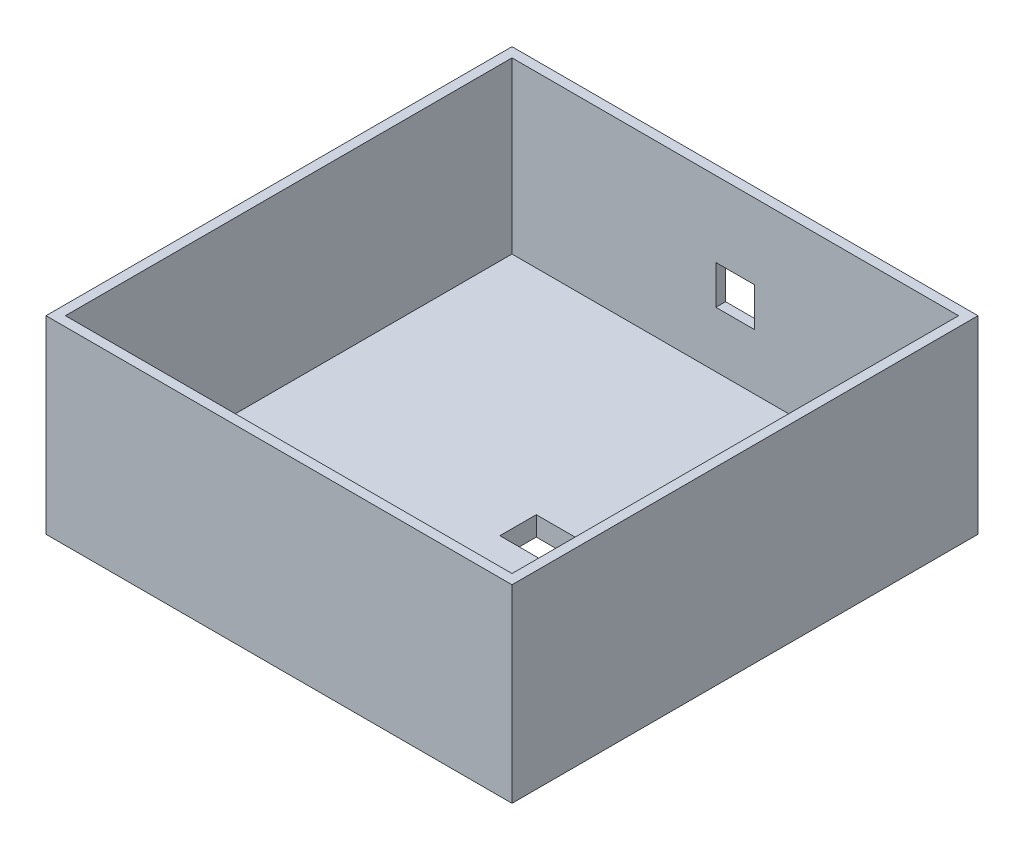
ISO-10303-21;
HEADER;
FILE_DESCRIPTION(('STEP AP214'),'2;1');
FILE_NAME('part.step','',(''),(''),'','','');
FILE_SCHEMA(('AUTOMOTIVE_DESIGN { 1 0 10303 214 1 1 1 1 }'));
ENDSEC;
DATA;
#1=APPLICATION_CONTEXT('core data for automotive mechanical design processes');
#2=APPLICATION_PROTOCOL_DEFINITION('international standard','automotive_design',2000,#1);
#3=PRODUCT_CONTEXT('',#1,'mechanical');
#4=PRODUCT('Part','Part','',(#3));
#5=PRODUCT_RELATED_PRODUCT_CATEGORY('part','',(#4));
#6=PRODUCT_DEFINITION_FORMATION('','',#4);
#7=PRODUCT_DEFINITION_CONTEXT('part definition',#1,'design');
#8=PRODUCT_DEFINITION('design','',#6,#7);
#9=PRODUCT_DEFINITION_SHAPE('','',#8);
#10=(LENGTH_UNIT() NAMED_UNIT(*) SI_UNIT(.MILLI.,.METRE.));
#11=(NAMED_UNIT(*) PLANE_ANGLE_UNIT() SI_UNIT($,.RADIAN.));
#12=(NAMED_UNIT(*) SI_UNIT($,.STERADIAN.) SOLID_ANGLE_UNIT());
#13=UNCERTAINTY_MEASURE_WITH_UNIT(LENGTH_MEASURE(1.E-05),#10,'distance_accuracy_value','');
#14=(GEOMETRIC_REPRESENTATION_CONTEXT(3) GLOBAL_UNCERTAINTY_ASSIGNED_CONTEXT((#13)) GLOBAL_UNIT_ASSIGNED_CONTEXT((#10,
#11,#12)) REPRESENTATION_CONTEXT('',''));
#15=CARTESIAN_POINT('',(0.,0.,0.));
#16=DIRECTION('',(0.,0.,1.));
#17=DIRECTION('',(1.,0.,0.));
#18=AXIS2_PLACEMENT_3D('',#15,#16,#17);
#19=CARTESIAN_POINT('',(0.,0.,0.));
#20=DIRECTION('',(0.,-1.,0.));
#21=DIRECTION('',(0.,0.,-1.));
#22=AXIS2_PLACEMENT_3D('',#19,#20,#21);
#23=PLANE('',#22);
#24=DIRECTION('',(0.,0.,-1.));
#25=VECTOR('',#24,1.);
#26=CARTESIAN_POINT('',(12.2500000000001,0.,-2.00000000000001));
#27=LINE('',#26,#25);
#28=CARTESIAN_POINT('',(12.2500000000001,0.,5.49999999999999));
#29=VERTEX_POINT('',#28);
#30=CARTESIAN_POINT('',(12.2500000000001,0.,-2.00000000000001));
#31=VERTEX_POINT('',#30);
#32=EDGE_CURVE('E244',#29,#31,#27,.T.);
#33=ORIENTED_EDGE('',*,*,#32,.T.);
#34=DIRECTION('',(-1.,0.,0.));
#35=VECTOR('',#34,1.);
#36=CARTESIAN_POINT('',(12.2500000000001,0.,-2.00000000000001));
#37=LINE('',#36,#35);
#38=CARTESIAN_POINT('',(3.00000000000012,0.,-2.00000000000001));
#39=VERTEX_POINT('',#38);
#40=EDGE_CURVE('E281',#31,#39,#37,.T.);
#41=ORIENTED_EDGE('',*,*,#40,.T.);
#42=DIRECTION('',(0.,0.,1.));
#43=VECTOR('',#42,1.);
#44=CARTESIAN_POINT('',(3.00000000000012,0.,-2.00000000000001));
#45=LINE('',#44,#43);
#46=CARTESIAN_POINT('',(3.00000000000012,0.,5.49999999999999));
#47=VERTEX_POINT('',#46);
#48=EDGE_CURVE('E278',#39,#47,#45,.T.);
#49=ORIENTED_EDGE('',*,*,#48,.T.);
#50=DIRECTION('',(1.,0.,0.));
#51=VECTOR('',#50,1.);
#52=CARTESIAN_POINT('',(12.2500000000001,0.,5.49999999999999));
#53=LINE('',#52,#51);
#54=EDGE_CURVE('E267',#47,#29,#53,.T.);
#55=ORIENTED_EDGE('',*,*,#54,.T.);
#56=EDGE_LOOP('',(#33,#41,#49,#55));
#57=FACE_BOUND('',#56,.T.);
#58=DIRECTION('',(0.,0.,1.));
#59=VECTOR('',#58,1.);
#60=CARTESIAN_POINT('',(-4.24999999999988,0.,19.5));
#61=LINE('',#60,#59);
#62=CARTESIAN_POINT('',(-4.24999999999988,0.,12.));
#63=VERTEX_POINT('',#62);
#64=CARTESIAN_POINT('',(-4.24999999999988,0.,19.5));
#65=VERTEX_POINT('',#64);
#66=EDGE_CURVE('E240',#63,#65,#61,.T.);
#67=ORIENTED_EDGE('',*,*,#66,.T.);
#68=DIRECTION('',(1.,0.,0.));
#69=VECTOR('',#68,1.);
#70=CARTESIAN_POINT('',(-4.24999999999988,0.,19.5));
#71=LINE('',#70,#69);
#72=CARTESIAN_POINT('',(5.00000000000012,0.,19.5));
#73=VERTEX_POINT('',#72);
#74=EDGE_CURVE('E243',#65,#73,#71,.T.);
#75=ORIENTED_EDGE('',*,*,#74,.T.);
#76=DIRECTION('',(0.,0.,-1.));
#77=VECTOR('',#76,1.);
#78=CARTESIAN_POINT('',(5.00000000000012,0.,19.5));
#79=LINE('',#78,#77);
#80=CARTESIAN_POINT('',(5.00000000000012,0.,12.));
#81=VERTEX_POINT('',#80);
#82=EDGE_CURVE('E247',#73,#81,#79,.T.);
#83=ORIENTED_EDGE('',*,*,#82,.T.);
#84=DIRECTION('',(-1.,0.,0.));
#85=VECTOR('',#84,1.);
#86=CARTESIAN_POINT('',(-4.24999999999988,0.,12.));
#87=LINE('',#86,#85);
#88=EDGE_CURVE('E250',#81,#63,#87,.T.);
#89=ORIENTED_EDGE('',*,*,#88,.T.);
#90=EDGE_LOOP('',(#67,#75,#83,#89));
#91=FACE_BOUND('',#90,.T.);
#92=DIRECTION('',(1.,0.,0.));
#93=VECTOR('',#92,1.);
#94=CARTESIAN_POINT('',(-48.,0.,48.));
#95=LINE('',#94,#93);
#96=CARTESIAN_POINT('',(-48.,0.,48.));
#97=VERTEX_POINT('',#96);
#98=CARTESIAN_POINT('',(48.,0.,48.));
#99=VERTEX_POINT('',#98);
#100=EDGE_CURVE('E212',#97,#99,#95,.T.);
#101=ORIENTED_EDGE('',*,*,#100,.F.);
#102=DIRECTION('',(0.,0.,1.));
#103=VECTOR('',#102,1.);
#104=CARTESIAN_POINT('',(-48.,0.,-48.));
#105=LINE('',#104,#103);
#106=CARTESIAN_POINT('',(-48.,0.,-48.));
#107=VERTEX_POINT('',#106);
#108=EDGE_CURVE('E54',#107,#97,#105,.T.);
#109=ORIENTED_EDGE('',*,*,#108,.F.);
#110=DIRECTION('',(-1.,0.,0.));
#111=VECTOR('',#110,1.);
#112=CARTESIAN_POINT('',(-48.,0.,-48.));
#113=LINE('',#112,#111);
#114=CARTESIAN_POINT('',(48.,0.,-48.));
#115=VERTEX_POINT('',#114);
#116=EDGE_CURVE('E219',#115,#107,#113,.T.);
#117=ORIENTED_EDGE('',*,*,#116,.F.);
#118=DIRECTION('',(0.,0.,-1.));
#119=VECTOR('',#118,1.);
#120=CARTESIAN_POINT('',(48.,0.,-48.));
#121=LINE('',#120,#119);
#122=EDGE_CURVE('E216',#99,#115,#121,.T.);
#123=ORIENTED_EDGE('',*,*,#122,.F.);
#124=EDGE_LOOP('',(#101,#109,#117,#123));
#125=FACE_BOUND('',#124,.T.);
#126=ADVANCED_FACE('F40',(#57,#91,#125),#23,.T.);
#127=CARTESIAN_POINT('',(0.,39.,0.));
#128=DIRECTION('',(0.,1.,0.));
#129=DIRECTION('',(0.,0.,1.));
#130=AXIS2_PLACEMENT_3D('',#127,#128,#129);
#131=PLANE('',#130);
#132=DIRECTION('',(0.,0.,1.));
#133=VECTOR('',#132,1.);
#134=CARTESIAN_POINT('',(-46.,39.,-46.));
#135=LINE('',#134,#133);
#136=CARTESIAN_POINT('',(-46.,39.,-46.));
#137=VERTEX_POINT('',#136);
#138=CARTESIAN_POINT('',(-46.,39.,46.));
#139=VERTEX_POINT('',#138);
#140=EDGE_CURVE('E313',#137,#139,#135,.T.);
#141=ORIENTED_EDGE('',*,*,#140,.F.);
#142=DIRECTION('',(-1.,0.,0.));
#143=VECTOR('',#142,1.);
#144=CARTESIAN_POINT('',(46.,39.,-46.));
#145=LINE('',#144,#143);
#146=CARTESIAN_POINT('',(46.,39.,-46.));
#147=VERTEX_POINT('',#146);
#148=EDGE_CURVE('E311',#147,#137,#145,.T.);
#149=ORIENTED_EDGE('',*,*,#148,.F.);
#150=DIRECTION('',(0.,0.,-1.));
#151=VECTOR('',#150,1.);
#152=CARTESIAN_POINT('',(46.,39.,46.));
#153=LINE('',#152,#151);
#154=CARTESIAN_POINT('',(46.,39.,46.));
#155=VERTEX_POINT('',#154);
#156=EDGE_CURVE('E308',#155,#147,#153,.T.);
#157=ORIENTED_EDGE('',*,*,#156,.F.);
#158=DIRECTION('',(1.,0.,0.));
#159=VECTOR('',#158,1.);
#160=CARTESIAN_POINT('',(-46.,39.,46.));
#161=LINE('',#160,#159);
#162=EDGE_CURVE('E306',#139,#155,#161,.T.);
#163=ORIENTED_EDGE('',*,*,#162,.F.);
#164=EDGE_LOOP('',(#141,#149,#157,#163));
#165=FACE_BOUND('',#164,.T.);
#166=DIRECTION('',(-1.,0.,0.));
#167=VECTOR('',#166,1.);
#168=CARTESIAN_POINT('',(-48.,39.,-48.));
#169=LINE('',#168,#167);
#170=CARTESIAN_POINT('',(48.,39.,-48.));
#171=VERTEX_POINT('',#170);
#172=CARTESIAN_POINT('',(-48.,39.,-48.));
#173=VERTEX_POINT('',#172);
#174=EDGE_CURVE('E213',#171,#173,#169,.T.);
#175=ORIENTED_EDGE('',*,*,#174,.T.);
#176=DIRECTION('',(0.,0.,1.));
#177=VECTOR('',#176,1.);
#178=CARTESIAN_POINT('',(-48.,39.,-48.));
#179=LINE('',#178,#177);
#180=CARTESIAN_POINT('',(-48.,39.,48.));
#181=VERTEX_POINT('',#180);
#182=EDGE_CURVE('E206',#173,#181,#179,.T.);
#183=ORIENTED_EDGE('',*,*,#182,.T.);
#184=DIRECTION('',(1.,0.,0.));
#185=VECTOR('',#184,1.);
#186=CARTESIAN_POINT('',(-48.,39.,48.));
#187=LINE('',#186,#185);
#188=CARTESIAN_POINT('',(48.,39.,48.));
#189=VERTEX_POINT('',#188);
#190=EDGE_CURVE('E225',#181,#189,#187,.T.);
#191=ORIENTED_EDGE('',*,*,#190,.T.);
#192=DIRECTION('',(0.,0.,-1.));
#193=VECTOR('',#192,1.);
#194=CARTESIAN_POINT('',(48.,39.,-48.));
#195=LINE('',#194,#193);
#196=EDGE_CURVE('E62',#189,#171,#195,.T.);
#197=ORIENTED_EDGE('',*,*,#196,.T.);
#198=EDGE_LOOP('',(#175,#183,#191,#197));
#199=FACE_BOUND('',#198,.T.);
#200=ADVANCED_FACE('F359',(#165,#199),#131,.T.);
#201=CARTESIAN_POINT('',(6.00000000000001,23.5,-40.));
#202=DIRECTION('',(0.,1.,0.));
#203=DIRECTION('',(0.,0.,1.));
#204=AXIS2_PLACEMENT_3D('',#201,#202,#203);
#205=PLANE('',#204);
#206=DIRECTION('',(-1.,0.,0.));
#207=VECTOR('',#206,1.);
#208=CARTESIAN_POINT('',(46.,23.5,-46.));
#209=LINE('',#208,#207);
#210=CARTESIAN_POINT('',(4.00000000000001,23.5,-46.));
#211=VERTEX_POINT('',#210);
#212=CARTESIAN_POINT('',(-4.,23.5,-46.));
#213=VERTEX_POINT('',#212);
#214=EDGE_CURVE('E47',#211,#213,#209,.T.);
#215=ORIENTED_EDGE('',*,*,#214,.T.);
#216=DIRECTION('',(0.,0.,-1.));
#217=VECTOR('',#216,1.);
#218=CARTESIAN_POINT('',(-4.,23.5,-46.));
#219=LINE('',#218,#217);
#220=CARTESIAN_POINT('',(-4.,23.5,-48.));
#221=VERTEX_POINT('',#220);
#222=EDGE_CURVE('E184',#213,#221,#219,.T.);
#223=ORIENTED_EDGE('',*,*,#222,.T.);
#224=DIRECTION('',(-1.,0.,0.));
#225=VECTOR('',#224,1.);
#226=CARTESIAN_POINT('',(6.00000000000001,23.5,-48.));
#227=LINE('',#226,#225);
#228=CARTESIAN_POINT('',(4.00000000000001,23.5,-48.));
#229=VERTEX_POINT('',#228);
#230=EDGE_CURVE('E193',#229,#221,#227,.T.);
#231=ORIENTED_EDGE('',*,*,#230,.F.);
#232=DIRECTION('',(0.,0.,-1.));
#233=VECTOR('',#232,1.);
#234=CARTESIAN_POINT('',(4.00000000000001,23.5,-46.));
#235=LINE('',#234,#233);
#236=EDGE_CURVE('E203',#211,#229,#235,.T.);
#237=ORIENTED_EDGE('',*,*,#236,.F.);
#238=EDGE_LOOP('',(#215,#223,#231,#237));
#239=FACE_BOUND('',#238,.T.);
#240=ADVANCED_FACE('F338',(#239),#205,.F.);
#241=CARTESIAN_POINT('',(6.,15.5,-40.));
#242=DIRECTION('',(0.,-1.,0.));
#243=DIRECTION('',(0.,0.,-1.));
#244=AXIS2_PLACEMENT_3D('',#241,#242,#243);
#245=PLANE('',#244);
#246=DIRECTION('',(1.,0.,0.));
#247=VECTOR('',#246,1.);
#248=CARTESIAN_POINT('',(6.,15.5,-48.));
#249=LINE('',#248,#247);
#250=CARTESIAN_POINT('',(-4.,15.5,-48.));
#251=VERTEX_POINT('',#250);
#252=CARTESIAN_POINT('',(4.,15.5,-48.));
#253=VERTEX_POINT('',#252);
#254=EDGE_CURVE('E12',#251,#253,#249,.T.);
#255=ORIENTED_EDGE('',*,*,#254,.F.);
#256=DIRECTION('',(0.,0.,-1.));
#257=VECTOR('',#256,1.);
#258=CARTESIAN_POINT('',(-4.,15.5,-46.));
#259=LINE('',#258,#257);
#260=CARTESIAN_POINT('',(-4.,15.5,-46.));
#261=VERTEX_POINT('',#260);
#262=EDGE_CURVE('E174',#261,#251,#259,.T.);
#263=ORIENTED_EDGE('',*,*,#262,.F.);
#264=DIRECTION('',(1.,0.,0.));
#265=VECTOR('',#264,1.);
#266=CARTESIAN_POINT('',(46.,15.5,-46.));
#267=LINE('',#266,#265);
#268=CARTESIAN_POINT('',(4.,15.5,-46.));
#269=VERTEX_POINT('',#268);
#270=EDGE_CURVE('E200',#261,#269,#267,.T.);
#271=ORIENTED_EDGE('',*,*,#270,.T.);
#272=DIRECTION('',(0.,0.,-1.));
#273=VECTOR('',#272,1.);
#274=CARTESIAN_POINT('',(4.,15.5,-46.));
#275=LINE('',#274,#273);
#276=EDGE_CURVE('E199',#269,#253,#275,.T.);
#277=ORIENTED_EDGE('',*,*,#276,.T.);
#278=EDGE_LOOP('',(#255,#263,#271,#277));
#279=FACE_BOUND('',#278,.T.);
#280=ADVANCED_FACE('F197',(#279),#245,.F.);
#281=CARTESIAN_POINT('',(0.,4.,0.));
#282=DIRECTION('',(0.,-1.,0.));
#283=DIRECTION('',(0.,0.,-1.));
#284=AXIS2_PLACEMENT_3D('',#281,#282,#283);
#285=PLANE('',#284);
#286=DIRECTION('',(0.,0.,1.));
#287=VECTOR('',#286,1.);
#288=CARTESIAN_POINT('',(-46.,4.,-46.));
#289=LINE('',#288,#287);
#290=CARTESIAN_POINT('',(-46.,4.,-46.));
#291=VERTEX_POINT('',#290);
#292=CARTESIAN_POINT('',(-46.,4.,46.));
#293=VERTEX_POINT('',#292);
#294=EDGE_CURVE('E309',#291,#293,#289,.T.);
#295=ORIENTED_EDGE('',*,*,#294,.T.);
#296=DIRECTION('',(1.,0.,0.));
#297=VECTOR('',#296,1.);
#298=CARTESIAN_POINT('',(-46.,4.,46.));
#299=LINE('',#298,#297);
#300=CARTESIAN_POINT('',(46.,4.,46.));
#301=VERTEX_POINT('',#300);
#302=EDGE_CURVE('E305',#293,#301,#299,.T.);
#303=ORIENTED_EDGE('',*,*,#302,.T.);
#304=DIRECTION('',(0.,0.,-1.));
#305=VECTOR('',#304,1.);
#306=CARTESIAN_POINT('',(46.,4.,46.));
#307=LINE('',#306,#305);
#308=CARTESIAN_POINT('',(46.,4.,-46.));
#309=VERTEX_POINT('',#308);
#310=EDGE_CURVE('E318',#301,#309,#307,.T.);
#311=ORIENTED_EDGE('',*,*,#310,.T.);
#312=DIRECTION('',(-1.,0.,0.));
#313=VECTOR('',#312,1.);
#314=CARTESIAN_POINT('',(46.,4.,-46.));
#315=LINE('',#314,#313);
#316=EDGE_CURVE('E321',#309,#291,#315,.T.);
#317=ORIENTED_EDGE('',*,*,#316,.T.);
#318=EDGE_LOOP('',(#295,#303,#311,#317));
#319=FACE_BOUND('',#318,.T.);
#320=DIRECTION('',(0.,0.,1.));
#321=VECTOR('',#320,1.);
#322=CARTESIAN_POINT('',(12.2500000000001,4.,0.));
#323=LINE('',#322,#321);
#324=CARTESIAN_POINT('',(12.2500000000001,4.,-2.00000000000001));
#325=VERTEX_POINT('',#324);
#326=CARTESIAN_POINT('',(12.2500000000001,4.,5.49999999999999));
#327=VERTEX_POINT('',#326);
#328=EDGE_CURVE('E303',#325,#327,#323,.T.);
#329=ORIENTED_EDGE('',*,*,#328,.T.);
#330=DIRECTION('',(-1.,0.,0.));
#331=VECTOR('',#330,1.);
#332=CARTESIAN_POINT('',(0.,4.,5.49999999999999));
#333=LINE('',#332,#331);
#334=CARTESIAN_POINT('',(3.00000000000012,4.,5.49999999999999));
#335=VERTEX_POINT('',#334);
#336=EDGE_CURVE('E288',#327,#335,#333,.T.);
#337=ORIENTED_EDGE('',*,*,#336,.T.);
#338=DIRECTION('',(0.,0.,-1.));
#339=VECTOR('',#338,1.);
#340=CARTESIAN_POINT('',(3.00000000000012,4.,0.));
#341=LINE('',#340,#339);
#342=CARTESIAN_POINT('',(3.00000000000012,4.,-2.00000000000001));
#343=VERTEX_POINT('',#342);
#344=EDGE_CURVE('E257',#335,#343,#341,.T.);
#345=ORIENTED_EDGE('',*,*,#344,.T.);
#346=DIRECTION('',(-1.,0.,0.));
#347=VECTOR('',#346,1.);
#348=CARTESIAN_POINT('',(0.,4.,-2.00000000000001));
#349=LINE('',#348,#347);
#350=EDGE_CURVE('E301',#325,#343,#349,.T.);
#351=ORIENTED_EDGE('',*,*,#350,.F.);
#352=EDGE_LOOP('',(#329,#337,#345,#351));
#353=FACE_BOUND('',#352,.T.);
#354=DIRECTION('',(0.,0.,-1.));
#355=VECTOR('',#354,1.);
#356=CARTESIAN_POINT('',(-4.24999999999988,4.,0.));
#357=LINE('',#356,#355);
#358=CARTESIAN_POINT('',(-4.24999999999988,4.,19.5));
#359=VERTEX_POINT('',#358);
#360=CARTESIAN_POINT('',(-4.24999999999988,4.,12.));
#361=VERTEX_POINT('',#360);
#362=EDGE_CURVE('E299',#359,#361,#357,.T.);
#363=ORIENTED_EDGE('',*,*,#362,.T.);
#364=DIRECTION('',(1.,0.,0.));
#365=VECTOR('',#364,1.);
#366=CARTESIAN_POINT('',(0.,4.,12.));
#367=LINE('',#366,#365);
#368=CARTESIAN_POINT('',(5.00000000000012,4.,12.));
#369=VERTEX_POINT('',#368);
#370=EDGE_CURVE('E294',#361,#369,#367,.T.);
#371=ORIENTED_EDGE('',*,*,#370,.T.);
#372=DIRECTION('',(0.,0.,1.));
#373=VECTOR('',#372,1.);
#374=CARTESIAN_POINT('',(5.00000000000012,4.,0.));
#375=LINE('',#374,#373);
#376=CARTESIAN_POINT('',(5.00000000000012,4.,19.5));
#377=VERTEX_POINT('',#376);
#378=EDGE_CURVE('E291',#369,#377,#375,.T.);
#379=ORIENTED_EDGE('',*,*,#378,.T.);
#380=DIRECTION('',(1.,0.,0.));
#381=VECTOR('',#380,1.);
#382=CARTESIAN_POINT('',(0.,4.,19.5));
#383=LINE('',#382,#381);
#384=EDGE_CURVE('E297',#359,#377,#383,.T.);
#385=ORIENTED_EDGE('',*,*,#384,.F.);
#386=EDGE_LOOP('',(#363,#371,#379,#385));
#387=FACE_BOUND('',#386,.T.);
#388=ADVANCED_FACE('F390',(#319,#353,#387),#285,.F.);
#389=CARTESIAN_POINT('',(-46.,39.,46.));
#390=DIRECTION('',(0.,0.,-1.));
#391=DIRECTION('',(-1.,0.,0.));
#392=AXIS2_PLACEMENT_3D('',#389,#390,#391);
#393=PLANE('',#392);
#394=ORIENTED_EDGE('',*,*,#302,.F.);
#395=DIRECTION('',(0.,-1.,0.));
#396=VECTOR('',#395,1.);
#397=CARTESIAN_POINT('',(-46.,39.,46.));
#398=LINE('',#397,#396);
#399=EDGE_CURVE('E315',#139,#293,#398,.T.);
#400=ORIENTED_EDGE('',*,*,#399,.F.);
#401=ORIENTED_EDGE('',*,*,#162,.T.);
#402=DIRECTION('',(0.,-1.,0.));
#403=VECTOR('',#402,1.);
#404=CARTESIAN_POINT('',(46.,39.,46.));
#405=LINE('',#404,#403);
#406=EDGE_CURVE('E331',#155,#301,#405,.T.);
#407=ORIENTED_EDGE('',*,*,#406,.T.);
#408=EDGE_LOOP('',(#394,#400,#401,#407));
#409=FACE_BOUND('',#408,.T.);
#410=ADVANCED_FACE('F432',(#409),#393,.T.);
#411=CARTESIAN_POINT('',(46.,39.,46.));
#412=DIRECTION('',(-1.,0.,0.));
#413=DIRECTION('',(0.,0.,1.));
#414=AXIS2_PLACEMENT_3D('',#411,#412,#413);
#415=PLANE('',#414);
#416=ORIENTED_EDGE('',*,*,#310,.F.);
#417=ORIENTED_EDGE('',*,*,#406,.F.);
#418=ORIENTED_EDGE('',*,*,#156,.T.);
#419=DIRECTION('',(0.,-1.,0.));
#420=VECTOR('',#419,1.);
#421=CARTESIAN_POINT('',(46.,39.,-46.));
#422=LINE('',#421,#420);
#423=EDGE_CURVE('E329',#147,#309,#422,.T.);
#424=ORIENTED_EDGE('',*,*,#423,.T.);
#425=EDGE_LOOP('',(#416,#417,#418,#424));
#426=FACE_BOUND('',#425,.T.);
#427=ADVANCED_FACE('F429',(#426),#415,.T.);
#428=CARTESIAN_POINT('',(46.,39.,-46.));
#429=DIRECTION('',(0.,0.,1.));
#430=DIRECTION('',(1.,0.,0.));
#431=AXIS2_PLACEMENT_3D('',#428,#429,#430);
#432=PLANE('',#431);
#433=ORIENTED_EDGE('',*,*,#270,.F.);
#434=DIRECTION('',(0.,-1.,0.));
#435=VECTOR('',#434,1.);
#436=CARTESIAN_POINT('',(-4.,23.5,-46.));
#437=LINE('',#436,#435);
#438=EDGE_CURVE('E180',#213,#261,#437,.T.);
#439=ORIENTED_EDGE('',*,*,#438,.F.);
#440=ORIENTED_EDGE('',*,*,#214,.F.);
#441=DIRECTION('',(0.,1.,0.));
#442=VECTOR('',#441,1.);
#443=CARTESIAN_POINT('',(4.00000000000001,23.5,-46.));
#444=LINE('',#443,#442);
#445=EDGE_CURVE('E204',#269,#211,#444,.T.);
#446=ORIENTED_EDGE('',*,*,#445,.F.);
#447=EDGE_LOOP('',(#433,#439,#440,#446));
#448=FACE_BOUND('',#447,.T.);
#449=ORIENTED_EDGE('',*,*,#148,.T.);
#450=DIRECTION('',(0.,-1.,0.));
#451=VECTOR('',#450,1.);
#452=CARTESIAN_POINT('',(-46.,39.,-46.));
#453=LINE('',#452,#451);
#454=EDGE_CURVE('E327',#137,#291,#453,.T.);
#455=ORIENTED_EDGE('',*,*,#454,.T.);
#456=ORIENTED_EDGE('',*,*,#316,.F.);
#457=ORIENTED_EDGE('',*,*,#423,.F.);
#458=EDGE_LOOP('',(#449,#455,#456,#457));
#459=FACE_BOUND('',#458,.T.);
#460=ADVANCED_FACE('F340',(#448,#459),#432,.T.);
#461=CARTESIAN_POINT('',(-46.,39.,-46.));
#462=DIRECTION('',(1.,0.,0.));
#463=DIRECTION('',(0.,0.,-1.));
#464=AXIS2_PLACEMENT_3D('',#461,#462,#463);
#465=PLANE('',#464);
#466=ORIENTED_EDGE('',*,*,#294,.F.);
#467=ORIENTED_EDGE('',*,*,#454,.F.);
#468=ORIENTED_EDGE('',*,*,#140,.T.);
#469=ORIENTED_EDGE('',*,*,#399,.T.);
#470=EDGE_LOOP('',(#466,#467,#468,#469));
#471=FACE_BOUND('',#470,.T.);
#472=ADVANCED_FACE('F422',(#471),#465,.T.);
#473=CARTESIAN_POINT('',(12.2500000000001,0.,5.49999999999999));
#474=DIRECTION('',(0.,0.,1.));
#475=DIRECTION('',(1.,0.,0.));
#476=AXIS2_PLACEMENT_3D('',#473,#474,#475);
#477=PLANE('',#476);
#478=DIRECTION('',(0.,1.,0.));
#479=VECTOR('',#478,1.);
#480=CARTESIAN_POINT('',(12.2500000000001,0.,5.49999999999999));
#481=LINE('',#480,#479);
#482=EDGE_CURVE('E239',#29,#327,#481,.T.);
#483=ORIENTED_EDGE('',*,*,#482,.F.);
#484=ORIENTED_EDGE('',*,*,#54,.F.);
#485=DIRECTION('',(0.,1.,0.));
#486=VECTOR('',#485,1.);
#487=CARTESIAN_POINT('',(3.00000000000012,0.,5.49999999999999));
#488=LINE('',#487,#486);
#489=EDGE_CURVE('E271',#47,#335,#488,.T.);
#490=ORIENTED_EDGE('',*,*,#489,.T.);
#491=ORIENTED_EDGE('',*,*,#336,.F.);
#492=EDGE_LOOP('',(#483,#484,#490,#491));
#493=FACE_BOUND('',#492,.T.);
#494=ADVANCED_FACE('F418',(#493),#477,.F.);
#495=CARTESIAN_POINT('',(3.00000000000012,0.,-2.00000000000001));
#496=DIRECTION('',(-1.,0.,0.));
#497=DIRECTION('',(0.,0.,1.));
#498=AXIS2_PLACEMENT_3D('',#495,#496,#497);
#499=PLANE('',#498);
#500=ORIENTED_EDGE('',*,*,#489,.F.);
#501=ORIENTED_EDGE('',*,*,#48,.F.);
#502=DIRECTION('',(0.,1.,0.));
#503=VECTOR('',#502,1.);
#504=CARTESIAN_POINT('',(3.00000000000012,0.,-2.00000000000001));
#505=LINE('',#504,#503);
#506=EDGE_CURVE('E268',#39,#343,#505,.T.);
#507=ORIENTED_EDGE('',*,*,#506,.T.);
#508=ORIENTED_EDGE('',*,*,#344,.F.);
#509=EDGE_LOOP('',(#500,#501,#507,#508));
#510=FACE_BOUND('',#509,.T.);
#511=ADVANCED_FACE('F411',(#510),#499,.F.);
#512=CARTESIAN_POINT('',(12.2500000000001,0.,-2.00000000000001));
#513=DIRECTION('',(1.,0.,0.));
#514=DIRECTION('',(0.,0.,-1.));
#515=AXIS2_PLACEMENT_3D('',#512,#513,#514);
#516=PLANE('',#515);
#517=DIRECTION('',(0.,1.,0.));
#518=VECTOR('',#517,1.);
#519=CARTESIAN_POINT('',(12.2500000000001,0.,-2.00000000000001));
#520=LINE('',#519,#518);
#521=EDGE_CURVE('E265',#31,#325,#520,.T.);
#522=ORIENTED_EDGE('',*,*,#521,.F.);
#523=ORIENTED_EDGE('',*,*,#32,.F.);
#524=ORIENTED_EDGE('',*,*,#482,.T.);
#525=ORIENTED_EDGE('',*,*,#328,.F.);
#526=EDGE_LOOP('',(#522,#523,#524,#525));
#527=FACE_BOUND('',#526,.T.);
#528=ADVANCED_FACE('F408',(#527),#516,.F.);
#529=CARTESIAN_POINT('',(12.2500000000001,0.,-2.00000000000001));
#530=DIRECTION('',(0.,0.,-1.));
#531=DIRECTION('',(-1.,0.,0.));
#532=AXIS2_PLACEMENT_3D('',#529,#530,#531);
#533=PLANE('',#532);
#534=ORIENTED_EDGE('',*,*,#506,.F.);
#535=ORIENTED_EDGE('',*,*,#40,.F.);
#536=ORIENTED_EDGE('',*,*,#521,.T.);
#537=ORIENTED_EDGE('',*,*,#350,.T.);
#538=EDGE_LOOP('',(#534,#535,#536,#537));
#539=FACE_BOUND('',#538,.T.);
#540=ADVANCED_FACE('F395',(#539),#533,.F.);
#541=CARTESIAN_POINT('',(-4.24999999999988,0.,12.));
#542=DIRECTION('',(0.,0.,-1.));
#543=DIRECTION('',(-1.,0.,0.));
#544=AXIS2_PLACEMENT_3D('',#541,#542,#543);
#545=PLANE('',#544);
#546=DIRECTION('',(0.,1.,0.));
#547=VECTOR('',#546,1.);
#548=CARTESIAN_POINT('',(-4.24999999999988,0.,12.));
#549=LINE('',#548,#547);
#550=EDGE_CURVE('E254',#63,#361,#549,.T.);
#551=ORIENTED_EDGE('',*,*,#550,.F.);
#552=ORIENTED_EDGE('',*,*,#88,.F.);
#553=DIRECTION('',(0.,1.,0.));
#554=VECTOR('',#553,1.);
#555=CARTESIAN_POINT('',(5.00000000000012,0.,12.));
#556=LINE('',#555,#554);
#557=EDGE_CURVE('E258',#81,#369,#556,.T.);
#558=ORIENTED_EDGE('',*,*,#557,.T.);
#559=ORIENTED_EDGE('',*,*,#370,.F.);
#560=EDGE_LOOP('',(#551,#552,#558,#559));
#561=FACE_BOUND('',#560,.T.);
#562=ADVANCED_FACE('F391',(#561),#545,.F.);
#563=CARTESIAN_POINT('',(5.00000000000012,0.,19.5));
#564=DIRECTION('',(1.,0.,0.));
#565=DIRECTION('',(0.,0.,-1.));
#566=AXIS2_PLACEMENT_3D('',#563,#564,#565);
#567=PLANE('',#566);
#568=ORIENTED_EDGE('',*,*,#557,.F.);
#569=ORIENTED_EDGE('',*,*,#82,.F.);
#570=DIRECTION('',(0.,1.,0.));
#571=VECTOR('',#570,1.);
#572=CARTESIAN_POINT('',(5.00000000000012,0.,19.5));
#573=LINE('',#572,#571);
#574=EDGE_CURVE('E261',#73,#377,#573,.T.);
#575=ORIENTED_EDGE('',*,*,#574,.T.);
#576=ORIENTED_EDGE('',*,*,#378,.F.);
#577=EDGE_LOOP('',(#568,#569,#575,#576));
#578=FACE_BOUND('',#577,.T.);
#579=ADVANCED_FACE('F394',(#578),#567,.F.);
#580=CARTESIAN_POINT('',(-4.24999999999988,0.,19.5));
#581=DIRECTION('',(-1.,0.,0.));
#582=DIRECTION('',(0.,0.,1.));
#583=AXIS2_PLACEMENT_3D('',#580,#581,#582);
#584=PLANE('',#583);
#585=DIRECTION('',(0.,1.,0.));
#586=VECTOR('',#585,1.);
#587=CARTESIAN_POINT('',(-4.24999999999988,0.,19.5));
#588=LINE('',#587,#586);
#589=EDGE_CURVE('E253',#65,#359,#588,.T.);
#590=ORIENTED_EDGE('',*,*,#589,.F.);
#591=ORIENTED_EDGE('',*,*,#66,.F.);
#592=ORIENTED_EDGE('',*,*,#550,.T.);
#593=ORIENTED_EDGE('',*,*,#362,.F.);
#594=EDGE_LOOP('',(#590,#591,#592,#593));
#595=FACE_BOUND('',#594,.T.);
#596=ADVANCED_FACE('F399',(#595),#584,.F.);
#597=CARTESIAN_POINT('',(-4.24999999999988,0.,19.5));
#598=DIRECTION('',(0.,0.,1.));
#599=DIRECTION('',(1.,0.,0.));
#600=AXIS2_PLACEMENT_3D('',#597,#598,#599);
#601=PLANE('',#600);
#602=ORIENTED_EDGE('',*,*,#574,.F.);
#603=ORIENTED_EDGE('',*,*,#74,.F.);
#604=ORIENTED_EDGE('',*,*,#589,.T.);
#605=ORIENTED_EDGE('',*,*,#384,.T.);
#606=EDGE_LOOP('',(#602,#603,#604,#605));
#607=FACE_BOUND('',#606,.T.);
#608=ADVANCED_FACE('F401',(#607),#601,.F.);
#609=CARTESIAN_POINT('',(-48.,0.,-48.));
#610=DIRECTION('',(0.,0.,-1.));
#611=DIRECTION('',(-1.,0.,0.));
#612=AXIS2_PLACEMENT_3D('',#609,#610,#611);
#613=PLANE('',#612);
#614=DIRECTION('',(0.,-1.,0.));
#615=VECTOR('',#614,1.);
#616=CARTESIAN_POINT('',(-4.,23.5,-48.));
#617=LINE('',#616,#615);
#618=EDGE_CURVE('E177',#221,#251,#617,.T.);
#619=ORIENTED_EDGE('',*,*,#618,.T.);
#620=ORIENTED_EDGE('',*,*,#254,.T.);
#621=DIRECTION('',(0.,1.,0.));
#622=VECTOR('',#621,1.);
#623=CARTESIAN_POINT('',(4.00000000000001,23.5,-48.));
#624=LINE('',#623,#622);
#625=EDGE_CURVE('E194',#253,#229,#624,.T.);
#626=ORIENTED_EDGE('',*,*,#625,.T.);
#627=ORIENTED_EDGE('',*,*,#230,.T.);
#628=EDGE_LOOP('',(#619,#620,#626,#627));
#629=FACE_BOUND('',#628,.T.);
#630=ORIENTED_EDGE('',*,*,#174,.F.);
#631=DIRECTION('',(0.,1.,0.));
#632=VECTOR('',#631,1.);
#633=CARTESIAN_POINT('',(48.,0.,-48.));
#634=LINE('',#633,#632);
#635=EDGE_CURVE('E233',#115,#171,#634,.T.);
#636=ORIENTED_EDGE('',*,*,#635,.F.);
#637=ORIENTED_EDGE('',*,*,#116,.T.);
#638=DIRECTION('',(0.,1.,0.));
#639=VECTOR('',#638,1.);
#640=CARTESIAN_POINT('',(-48.,0.,-48.));
#641=LINE('',#640,#639);
#642=EDGE_CURVE('E231',#107,#173,#641,.T.);
#643=ORIENTED_EDGE('',*,*,#642,.T.);
#644=EDGE_LOOP('',(#630,#636,#637,#643));
#645=FACE_BOUND('',#644,.T.);
#646=ADVANCED_FACE('F188',(#629,#645),#613,.T.);
#647=CARTESIAN_POINT('',(-48.,0.,-48.));
#648=DIRECTION('',(-1.,0.,0.));
#649=DIRECTION('',(0.,0.,1.));
#650=AXIS2_PLACEMENT_3D('',#647,#648,#649);
#651=PLANE('',#650);
#652=ORIENTED_EDGE('',*,*,#182,.F.);
#653=ORIENTED_EDGE('',*,*,#642,.F.);
#654=ORIENTED_EDGE('',*,*,#108,.T.);
#655=DIRECTION('',(0.,1.,0.));
#656=VECTOR('',#655,1.);
#657=CARTESIAN_POINT('',(-48.,0.,48.));
#658=LINE('',#657,#656);
#659=EDGE_CURVE('E222',#97,#181,#658,.T.);
#660=ORIENTED_EDGE('',*,*,#659,.T.);
#661=EDGE_LOOP('',(#652,#653,#654,#660));
#662=FACE_BOUND('',#661,.T.);
#663=ADVANCED_FACE('F376',(#662),#651,.T.);
#664=CARTESIAN_POINT('',(48.,0.,-48.));
#665=DIRECTION('',(1.,0.,0.));
#666=DIRECTION('',(0.,0.,-1.));
#667=AXIS2_PLACEMENT_3D('',#664,#665,#666);
#668=PLANE('',#667);
#669=ORIENTED_EDGE('',*,*,#196,.F.);
#670=DIRECTION('',(0.,1.,0.));
#671=VECTOR('',#670,1.);
#672=CARTESIAN_POINT('',(48.,0.,48.));
#673=LINE('',#672,#671);
#674=EDGE_CURVE('E235',#99,#189,#673,.T.);
#675=ORIENTED_EDGE('',*,*,#674,.F.);
#676=ORIENTED_EDGE('',*,*,#122,.T.);
#677=ORIENTED_EDGE('',*,*,#635,.T.);
#678=EDGE_LOOP('',(#669,#675,#676,#677));
#679=FACE_BOUND('',#678,.T.);
#680=ADVANCED_FACE('F354',(#679),#668,.T.);
#681=CARTESIAN_POINT('',(-48.,0.,48.));
#682=DIRECTION('',(0.,0.,1.));
#683=DIRECTION('',(1.,0.,0.));
#684=AXIS2_PLACEMENT_3D('',#681,#682,#683);
#685=PLANE('',#684);
#686=ORIENTED_EDGE('',*,*,#190,.F.);
#687=ORIENTED_EDGE('',*,*,#659,.F.);
#688=ORIENTED_EDGE('',*,*,#100,.T.);
#689=ORIENTED_EDGE('',*,*,#674,.T.);
#690=EDGE_LOOP('',(#686,#687,#688,#689));
#691=FACE_BOUND('',#690,.T.);
#692=ADVANCED_FACE('F346',(#691),#685,.T.);
#693=CARTESIAN_POINT('',(4.00000000000001,23.5,-46.));
#694=DIRECTION('',(-1.,0.,0.));
#695=DIRECTION('',(0.,-1.,0.));
#696=AXIS2_PLACEMENT_3D('',#693,#694,#695);
#697=PLANE('',#696);
#698=ORIENTED_EDGE('',*,*,#625,.F.);
#699=ORIENTED_EDGE('',*,*,#276,.F.);
#700=ORIENTED_EDGE('',*,*,#445,.T.);
#701=ORIENTED_EDGE('',*,*,#236,.T.);
#702=EDGE_LOOP('',(#698,#699,#700,#701));
#703=FACE_BOUND('',#702,.T.);
#704=ADVANCED_FACE('F344',(#703),#697,.T.);
#705=CARTESIAN_POINT('',(-4.,23.5,-46.));
#706=DIRECTION('',(1.,0.,0.));
#707=DIRECTION('',(0.,1.,0.));
#708=AXIS2_PLACEMENT_3D('',#705,#706,#707);
#709=PLANE('',#708);
#710=ORIENTED_EDGE('',*,*,#618,.F.);
#711=ORIENTED_EDGE('',*,*,#222,.F.);
#712=ORIENTED_EDGE('',*,*,#438,.T.);
#713=ORIENTED_EDGE('',*,*,#262,.T.);
#714=EDGE_LOOP('',(#710,#711,#712,#713));
#715=FACE_BOUND('',#714,.T.);
#716=ADVANCED_FACE('F176',(#715),#709,.T.);
#717=CLOSED_SHELL('',(#126,#200,#240,#280,#388,#410,#427,#460,#472,#494,#511,#528,#540,#562,
#579,#596,#608,#646,#663,#680,#692,#704,#716));
#718=MANIFOLD_SOLID_BREP('B2',#717);
#719=ADVANCED_BREP_SHAPE_REPRESENTATION('',(#18,#718),#14);
#720=SHAPE_DEFINITION_REPRESENTATION(#9,#719);
ENDSEC;
END-ISO-10303-21;
